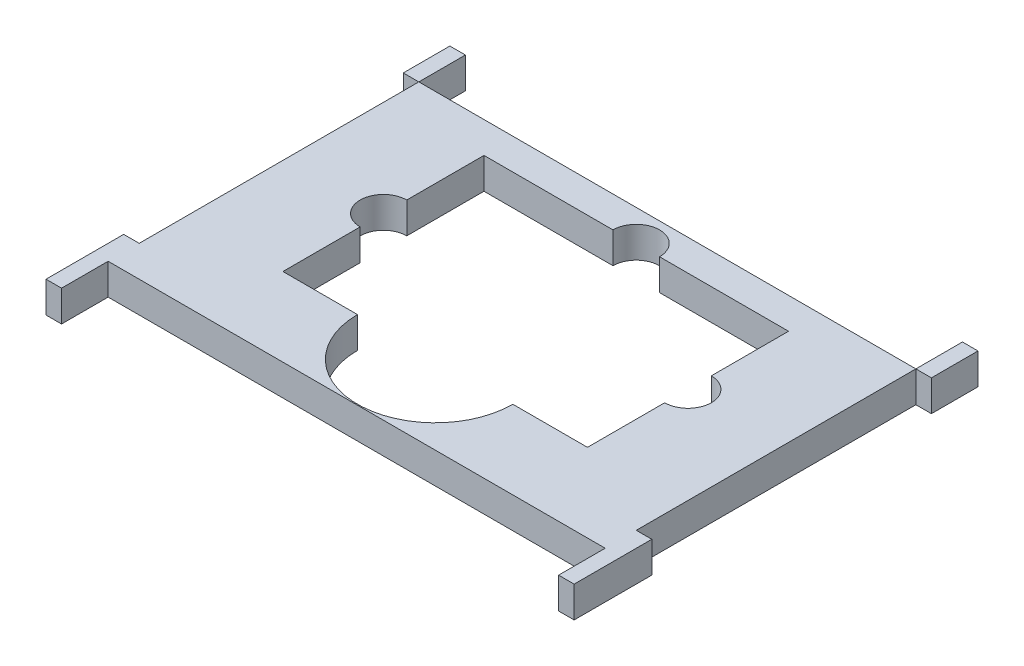
ISO-10303-21;
HEADER;
FILE_DESCRIPTION(('STEP AP214'),'2;1');
FILE_NAME('part.step','',(''),(''),'','','');
FILE_SCHEMA(('AUTOMOTIVE_DESIGN { 1 0 10303 214 1 1 1 1 }'));
ENDSEC;
DATA;
#1=APPLICATION_CONTEXT('core data for automotive mechanical design processes');
#2=APPLICATION_PROTOCOL_DEFINITION('international standard','automotive_design',2000,#1);
#3=PRODUCT_CONTEXT('',#1,'mechanical');
#4=PRODUCT('Part','Part','',(#3));
#5=PRODUCT_RELATED_PRODUCT_CATEGORY('part','',(#4));
#6=PRODUCT_DEFINITION_FORMATION('','',#4);
#7=PRODUCT_DEFINITION_CONTEXT('part definition',#1,'design');
#8=PRODUCT_DEFINITION('design','',#6,#7);
#9=PRODUCT_DEFINITION_SHAPE('','',#8);
#10=(LENGTH_UNIT() NAMED_UNIT(*) SI_UNIT(.MILLI.,.METRE.));
#11=(NAMED_UNIT(*) PLANE_ANGLE_UNIT() SI_UNIT($,.RADIAN.));
#12=(NAMED_UNIT(*) SI_UNIT($,.STERADIAN.) SOLID_ANGLE_UNIT());
#13=UNCERTAINTY_MEASURE_WITH_UNIT(LENGTH_MEASURE(1.E-05),#10,'distance_accuracy_value','');
#14=(GEOMETRIC_REPRESENTATION_CONTEXT(3) GLOBAL_UNCERTAINTY_ASSIGNED_CONTEXT((#13)) GLOBAL_UNIT_ASSIGNED_CONTEXT((#10,
#11,#12)) REPRESENTATION_CONTEXT('',''));
#15=CARTESIAN_POINT('',(0.,0.,0.));
#16=DIRECTION('',(0.,0.,1.));
#17=DIRECTION('',(1.,0.,0.));
#18=AXIS2_PLACEMENT_3D('',#15,#16,#17);
#19=CARTESIAN_POINT('',(101.6,12.7,-82.55));
#20=DIRECTION('',(1.,0.,0.));
#21=DIRECTION('',(0.,0.,-1.));
#22=AXIS2_PLACEMENT_3D('',#19,#20,#21);
#23=PLANE('',#22);
#24=DIRECTION('',(0.,0.,1.));
#25=VECTOR('',#24,1.);
#26=CARTESIAN_POINT('',(101.6,0.,-82.55));
#27=LINE('',#26,#25);
#28=CARTESIAN_POINT('',(101.6,0.,-82.55));
#29=VERTEX_POINT('',#28);
#30=CARTESIAN_POINT('',(101.6,0.,-63.4999999999999));
#31=VERTEX_POINT('',#30);
#32=EDGE_CURVE('E106',#29,#31,#27,.T.);
#33=ORIENTED_EDGE('',*,*,#32,.T.);
#34=DIRECTION('',(0.,-1.,0.));
#35=VECTOR('',#34,1.);
#36=CARTESIAN_POINT('',(101.6,12.7,-63.4999999999999));
#37=LINE('',#36,#35);
#38=CARTESIAN_POINT('',(101.6,12.7,-63.4999999999999));
#39=VERTEX_POINT('',#38);
#40=EDGE_CURVE('E12',#39,#31,#37,.T.);
#41=ORIENTED_EDGE('',*,*,#40,.F.);
#42=DIRECTION('',(0.,0.,1.));
#43=VECTOR('',#42,1.);
#44=CARTESIAN_POINT('',(101.6,12.7,-82.55));
#45=LINE('',#44,#43);
#46=CARTESIAN_POINT('',(101.6,12.7,-82.55));
#47=VERTEX_POINT('',#46);
#48=EDGE_CURVE('E94',#47,#39,#45,.T.);
#49=ORIENTED_EDGE('',*,*,#48,.F.);
#50=DIRECTION('',(0.,-1.,0.));
#51=VECTOR('',#50,1.);
#52=CARTESIAN_POINT('',(101.6,12.7,-82.55));
#53=LINE('',#52,#51);
#54=EDGE_CURVE('E102',#47,#29,#53,.T.);
#55=ORIENTED_EDGE('',*,*,#54,.T.);
#56=EDGE_LOOP('',(#33,#41,#49,#55));
#57=FACE_BOUND('',#56,.T.);
#58=ADVANCED_FACE('F43',(#57),#23,.F.);
#59=CARTESIAN_POINT('',(101.6,12.7,-63.4999999999999));
#60=DIRECTION('',(0.,0.,-1.));
#61=DIRECTION('',(-1.,0.,0.));
#62=AXIS2_PLACEMENT_3D('',#59,#60,#61);
#63=PLANE('',#62);
#64=DIRECTION('',(1.,0.,0.));
#65=VECTOR('',#64,1.);
#66=CARTESIAN_POINT('',(101.6,0.,-63.4999999999999));
#67=LINE('',#66,#65);
#68=CARTESIAN_POINT('',(107.95,0.,-63.5));
#69=VERTEX_POINT('',#68);
#70=EDGE_CURVE('E98',#31,#69,#67,.T.);
#71=ORIENTED_EDGE('',*,*,#70,.T.);
#72=DIRECTION('',(0.,-1.,0.));
#73=VECTOR('',#72,1.);
#74=CARTESIAN_POINT('',(107.95,12.7,-63.5));
#75=LINE('',#74,#73);
#76=CARTESIAN_POINT('',(107.95,12.7,-63.5));
#77=VERTEX_POINT('',#76);
#78=EDGE_CURVE('E51',#77,#69,#75,.T.);
#79=ORIENTED_EDGE('',*,*,#78,.F.);
#80=DIRECTION('',(1.,0.,0.));
#81=VECTOR('',#80,1.);
#82=CARTESIAN_POINT('',(101.6,12.7,-63.4999999999999));
#83=LINE('',#82,#81);
#84=EDGE_CURVE('E89',#39,#77,#83,.T.);
#85=ORIENTED_EDGE('',*,*,#84,.F.);
#86=ORIENTED_EDGE('',*,*,#40,.T.);
#87=EDGE_LOOP('',(#71,#79,#85,#86));
#88=FACE_BOUND('',#87,.T.);
#89=ADVANCED_FACE('F97',(#88),#63,.F.);
#90=CARTESIAN_POINT('',(107.95,12.7,-63.5));
#91=DIRECTION('',(-1.,0.,0.));
#92=DIRECTION('',(0.,0.,1.));
#93=AXIS2_PLACEMENT_3D('',#90,#91,#92);
#94=PLANE('',#93);
#95=DIRECTION('',(0.,0.,-1.));
#96=VECTOR('',#95,1.);
#97=CARTESIAN_POINT('',(107.95,0.,-63.5));
#98=LINE('',#97,#96);
#99=CARTESIAN_POINT('',(107.949999999999,0.,-82.55));
#100=VERTEX_POINT('',#99);
#101=EDGE_CURVE('E76',#69,#100,#98,.T.);
#102=ORIENTED_EDGE('',*,*,#101,.T.);
#103=DIRECTION('',(0.,-1.,0.));
#104=VECTOR('',#103,1.);
#105=CARTESIAN_POINT('',(107.949999999999,12.7,-82.55));
#106=LINE('',#105,#104);
#107=CARTESIAN_POINT('',(107.949999999999,12.7,-82.55));
#108=VERTEX_POINT('',#107);
#109=EDGE_CURVE('E99',#108,#100,#106,.T.);
#110=ORIENTED_EDGE('',*,*,#109,.F.);
#111=DIRECTION('',(0.,0.,-1.));
#112=VECTOR('',#111,1.);
#113=CARTESIAN_POINT('',(107.95,12.7,-63.5));
#114=LINE('',#113,#112);
#115=EDGE_CURVE('E92',#77,#108,#114,.T.);
#116=ORIENTED_EDGE('',*,*,#115,.F.);
#117=ORIENTED_EDGE('',*,*,#78,.T.);
#118=EDGE_LOOP('',(#102,#110,#116,#117));
#119=FACE_BOUND('',#118,.T.);
#120=ADVANCED_FACE('F100',(#119),#94,.F.);
#121=CARTESIAN_POINT('',(107.949999999999,12.7,-82.55));
#122=DIRECTION('',(0.,0.,1.));
#123=DIRECTION('',(1.,0.,0.));
#124=AXIS2_PLACEMENT_3D('',#121,#122,#123);
#125=PLANE('',#124);
#126=DIRECTION('',(-1.,0.,0.));
#127=VECTOR('',#126,1.);
#128=CARTESIAN_POINT('',(107.949999999999,0.,-82.55));
#129=LINE('',#128,#127);
#130=EDGE_CURVE('E82',#100,#29,#129,.T.);
#131=ORIENTED_EDGE('',*,*,#130,.T.);
#132=ORIENTED_EDGE('',*,*,#54,.F.);
#133=DIRECTION('',(-1.,0.,0.));
#134=VECTOR('',#133,1.);
#135=CARTESIAN_POINT('',(107.949999999999,12.7,-82.55));
#136=LINE('',#135,#134);
#137=EDGE_CURVE('E59',#108,#47,#136,.T.);
#138=ORIENTED_EDGE('',*,*,#137,.F.);
#139=ORIENTED_EDGE('',*,*,#109,.T.);
#140=EDGE_LOOP('',(#131,#132,#138,#139));
#141=FACE_BOUND('',#140,.T.);
#142=ADVANCED_FACE('F113',(#141),#125,.F.);
#143=CARTESIAN_POINT('',(0.,12.7,0.));
#144=DIRECTION('',(0.,1.,0.));
#145=DIRECTION('',(0.,0.,1.));
#146=AXIS2_PLACEMENT_3D('',#143,#144,#145);
#147=PLANE('',#146);
#148=ORIENTED_EDGE('',*,*,#48,.T.);
#149=ORIENTED_EDGE('',*,*,#84,.T.);
#150=ORIENTED_EDGE('',*,*,#115,.T.);
#151=ORIENTED_EDGE('',*,*,#137,.T.);
#152=EDGE_LOOP('',(#148,#149,#150,#151));
#153=FACE_BOUND('',#152,.T.);
#154=ADVANCED_FACE('F90',(#153),#147,.T.);
#155=CARTESIAN_POINT('',(0.,0.,0.));
#156=DIRECTION('',(0.,1.,0.));
#157=DIRECTION('',(0.,0.,1.));
#158=AXIS2_PLACEMENT_3D('',#155,#156,#157);
#159=PLANE('',#158);
#160=ORIENTED_EDGE('',*,*,#32,.F.);
#161=ORIENTED_EDGE('',*,*,#130,.F.);
#162=ORIENTED_EDGE('',*,*,#101,.F.);
#163=ORIENTED_EDGE('',*,*,#70,.F.);
#164=EDGE_LOOP('',(#160,#161,#162,#163));
#165=FACE_BOUND('',#164,.T.);
#166=ADVANCED_FACE('F116',(#165),#159,.F.);
#167=CLOSED_SHELL('',(#58,#89,#120,#142,#154,#166));
#168=MANIFOLD_SOLID_BREP('B2',#167);
#169=CARTESIAN_POINT('',(-101.6,12.7,-63.4999999999999));
#170=DIRECTION('',(0.,0.,-1.));
#171=DIRECTION('',(-1.,0.,0.));
#172=AXIS2_PLACEMENT_3D('',#169,#170,#171);
#173=PLANE('',#172);
#174=DIRECTION('',(1.,0.,0.));
#175=VECTOR('',#174,1.);
#176=CARTESIAN_POINT('',(-101.6,0.,-63.4999999999999));
#177=LINE('',#176,#175);
#178=CARTESIAN_POINT('',(-107.95,0.,-63.5));
#179=VERTEX_POINT('',#178);
#180=CARTESIAN_POINT('',(-101.6,0.,-63.4999999999999));
#181=VERTEX_POINT('',#180);
#182=EDGE_CURVE('E238',#179,#181,#177,.T.);
#183=ORIENTED_EDGE('',*,*,#182,.T.);
#184=DIRECTION('',(0.,-1.,0.));
#185=VECTOR('',#184,1.);
#186=CARTESIAN_POINT('',(-101.6,12.7,-63.4999999999999));
#187=LINE('',#186,#185);
#188=CARTESIAN_POINT('',(-101.6,12.7,-63.4999999999999));
#189=VERTEX_POINT('',#188);
#190=EDGE_CURVE('E41',#189,#181,#187,.T.);
#191=ORIENTED_EDGE('',*,*,#190,.F.);
#192=DIRECTION('',(1.,0.,0.));
#193=VECTOR('',#192,1.);
#194=CARTESIAN_POINT('',(-101.6,12.7,-63.4999999999999));
#195=LINE('',#194,#193);
#196=CARTESIAN_POINT('',(-107.95,12.7,-63.5));
#197=VERTEX_POINT('',#196);
#198=EDGE_CURVE('E226',#197,#189,#195,.T.);
#199=ORIENTED_EDGE('',*,*,#198,.F.);
#200=DIRECTION('',(0.,-1.,0.));
#201=VECTOR('',#200,1.);
#202=CARTESIAN_POINT('',(-107.95,12.7,-63.5));
#203=LINE('',#202,#201);
#204=EDGE_CURVE('E234',#197,#179,#203,.T.);
#205=ORIENTED_EDGE('',*,*,#204,.T.);
#206=EDGE_LOOP('',(#183,#191,#199,#205));
#207=FACE_BOUND('',#206,.T.);
#208=ADVANCED_FACE('F175',(#207),#173,.F.);
#209=CARTESIAN_POINT('',(-101.6,12.7,-82.55));
#210=DIRECTION('',(-1.,0.,0.));
#211=DIRECTION('',(0.,0.,1.));
#212=AXIS2_PLACEMENT_3D('',#209,#210,#211);
#213=PLANE('',#212);
#214=DIRECTION('',(0.,0.,-1.));
#215=VECTOR('',#214,1.);
#216=CARTESIAN_POINT('',(-101.6,0.,-82.55));
#217=LINE('',#216,#215);
#218=CARTESIAN_POINT('',(-101.6,0.,-82.55));
#219=VERTEX_POINT('',#218);
#220=EDGE_CURVE('E230',#181,#219,#217,.T.);
#221=ORIENTED_EDGE('',*,*,#220,.T.);
#222=DIRECTION('',(0.,-1.,0.));
#223=VECTOR('',#222,1.);
#224=CARTESIAN_POINT('',(-101.6,12.7,-82.55));
#225=LINE('',#224,#223);
#226=CARTESIAN_POINT('',(-101.6,12.7,-82.55));
#227=VERTEX_POINT('',#226);
#228=EDGE_CURVE('E183',#227,#219,#225,.T.);
#229=ORIENTED_EDGE('',*,*,#228,.F.);
#230=DIRECTION('',(0.,0.,-1.));
#231=VECTOR('',#230,1.);
#232=CARTESIAN_POINT('',(-101.6,12.7,-82.55));
#233=LINE('',#232,#231);
#234=EDGE_CURVE('E221',#189,#227,#233,.T.);
#235=ORIENTED_EDGE('',*,*,#234,.F.);
#236=ORIENTED_EDGE('',*,*,#190,.T.);
#237=EDGE_LOOP('',(#221,#229,#235,#236));
#238=FACE_BOUND('',#237,.T.);
#239=ADVANCED_FACE('F229',(#238),#213,.F.);
#240=CARTESIAN_POINT('',(-107.949999999999,12.7,-82.55));
#241=DIRECTION('',(0.,0.,1.));
#242=DIRECTION('',(1.,0.,0.));
#243=AXIS2_PLACEMENT_3D('',#240,#241,#242);
#244=PLANE('',#243);
#245=DIRECTION('',(-1.,0.,0.));
#246=VECTOR('',#245,1.);
#247=CARTESIAN_POINT('',(-107.949999999999,0.,-82.55));
#248=LINE('',#247,#246);
#249=CARTESIAN_POINT('',(-107.949999999999,0.,-82.55));
#250=VERTEX_POINT('',#249);
#251=EDGE_CURVE('E208',#219,#250,#248,.T.);
#252=ORIENTED_EDGE('',*,*,#251,.T.);
#253=DIRECTION('',(0.,-1.,0.));
#254=VECTOR('',#253,1.);
#255=CARTESIAN_POINT('',(-107.949999999999,12.7,-82.55));
#256=LINE('',#255,#254);
#257=CARTESIAN_POINT('',(-107.949999999999,12.7,-82.55));
#258=VERTEX_POINT('',#257);
#259=EDGE_CURVE('E231',#258,#250,#256,.T.);
#260=ORIENTED_EDGE('',*,*,#259,.F.);
#261=DIRECTION('',(-1.,0.,0.));
#262=VECTOR('',#261,1.);
#263=CARTESIAN_POINT('',(-107.949999999999,12.7,-82.55));
#264=LINE('',#263,#262);
#265=EDGE_CURVE('E224',#227,#258,#264,.T.);
#266=ORIENTED_EDGE('',*,*,#265,.F.);
#267=ORIENTED_EDGE('',*,*,#228,.T.);
#268=EDGE_LOOP('',(#252,#260,#266,#267));
#269=FACE_BOUND('',#268,.T.);
#270=ADVANCED_FACE('F232',(#269),#244,.F.);
#271=CARTESIAN_POINT('',(-107.95,12.7,-63.5));
#272=DIRECTION('',(1.,0.,0.));
#273=DIRECTION('',(0.,0.,-1.));
#274=AXIS2_PLACEMENT_3D('',#271,#272,#273);
#275=PLANE('',#274);
#276=DIRECTION('',(0.,0.,1.));
#277=VECTOR('',#276,1.);
#278=CARTESIAN_POINT('',(-107.95,0.,-63.5));
#279=LINE('',#278,#277);
#280=EDGE_CURVE('E214',#250,#179,#279,.T.);
#281=ORIENTED_EDGE('',*,*,#280,.T.);
#282=ORIENTED_EDGE('',*,*,#204,.F.);
#283=DIRECTION('',(0.,0.,1.));
#284=VECTOR('',#283,1.);
#285=CARTESIAN_POINT('',(-107.95,12.7,-63.5));
#286=LINE('',#285,#284);
#287=EDGE_CURVE('E191',#258,#197,#286,.T.);
#288=ORIENTED_EDGE('',*,*,#287,.F.);
#289=ORIENTED_EDGE('',*,*,#259,.T.);
#290=EDGE_LOOP('',(#281,#282,#288,#289));
#291=FACE_BOUND('',#290,.T.);
#292=ADVANCED_FACE('F245',(#291),#275,.F.);
#293=CARTESIAN_POINT('',(0.,12.7,0.));
#294=DIRECTION('',(0.,-1.,0.));
#295=DIRECTION('',(0.,0.,-1.));
#296=AXIS2_PLACEMENT_3D('',#293,#294,#295);
#297=PLANE('',#296);
#298=ORIENTED_EDGE('',*,*,#198,.T.);
#299=ORIENTED_EDGE('',*,*,#234,.T.);
#300=ORIENTED_EDGE('',*,*,#265,.T.);
#301=ORIENTED_EDGE('',*,*,#287,.T.);
#302=EDGE_LOOP('',(#298,#299,#300,#301));
#303=FACE_BOUND('',#302,.T.);
#304=ADVANCED_FACE('F222',(#303),#297,.F.);
#305=CARTESIAN_POINT('',(0.,0.,0.));
#306=DIRECTION('',(0.,-1.,0.));
#307=DIRECTION('',(0.,0.,-1.));
#308=AXIS2_PLACEMENT_3D('',#305,#306,#307);
#309=PLANE('',#308);
#310=ORIENTED_EDGE('',*,*,#182,.F.);
#311=ORIENTED_EDGE('',*,*,#280,.F.);
#312=ORIENTED_EDGE('',*,*,#251,.F.);
#313=ORIENTED_EDGE('',*,*,#220,.F.);
#314=EDGE_LOOP('',(#310,#311,#312,#313));
#315=FACE_BOUND('',#314,.T.);
#316=ADVANCED_FACE('F248',(#315),#309,.T.);
#317=CLOSED_SHELL('',(#208,#239,#270,#292,#304,#316));
#318=MANIFOLD_SOLID_BREP('B6',#317);
#319=CARTESIAN_POINT('',(-62.25,12.7,-50.8));
#320=DIRECTION('',(1.,0.,0.));
#321=DIRECTION('',(0.,0.,-1.));
#322=AXIS2_PLACEMENT_3D('',#319,#320,#321);
#323=PLANE('',#322);
#324=DIRECTION('',(0.,1.,0.));
#325=VECTOR('',#324,1.);
#326=CARTESIAN_POINT('',(-62.25,0.,-19.225000031));
#327=LINE('',#326,#325);
#328=CARTESIAN_POINT('',(-62.25,0.,-19.225000031));
#329=VERTEX_POINT('',#328);
#330=CARTESIAN_POINT('',(-62.25,12.7,-19.225000031));
#331=VERTEX_POINT('',#330);
#332=EDGE_CURVE('E173',#329,#331,#327,.T.);
#333=ORIENTED_EDGE('',*,*,#332,.F.);
#334=DIRECTION('',(0.,0.,1.));
#335=VECTOR('',#334,1.);
#336=CARTESIAN_POINT('',(-62.25,0.,-50.8));
#337=LINE('',#336,#335);
#338=CARTESIAN_POINT('',(-62.25,0.,-50.8));
#339=VERTEX_POINT('',#338);
#340=EDGE_CURVE('E493',#339,#329,#337,.T.);
#341=ORIENTED_EDGE('',*,*,#340,.F.);
#342=DIRECTION('',(0.,-1.,0.));
#343=VECTOR('',#342,1.);
#344=CARTESIAN_POINT('',(-62.25,12.7,-50.8));
#345=LINE('',#344,#343);
#346=CARTESIAN_POINT('',(-62.25,12.7,-50.8));
#347=VERTEX_POINT('',#346);
#348=EDGE_CURVE('E485',#347,#339,#345,.T.);
#349=ORIENTED_EDGE('',*,*,#348,.F.);
#350=DIRECTION('',(0.,0.,1.));
#351=VECTOR('',#350,1.);
#352=CARTESIAN_POINT('',(-62.25,12.7,-50.8));
#353=LINE('',#352,#351);
#354=EDGE_CURVE('E579',#347,#331,#353,.T.);
#355=ORIENTED_EDGE('',*,*,#354,.T.);
#356=EDGE_LOOP('',(#333,#341,#349,#355));
#357=FACE_BOUND('',#356,.T.);
#358=ADVANCED_FACE('F298',(#357),#323,.T.);
#359=CARTESIAN_POINT('',(-62.25,12.7,31.3999999380001));
#360=DIRECTION('',(0.,0.,-1.));
#361=DIRECTION('',(-1.,0.,0.));
#362=AXIS2_PLACEMENT_3D('',#359,#360,#361);
#363=PLANE('',#362);
#364=DIRECTION('',(0.,1.,0.));
#365=VECTOR('',#364,1.);
#366=CARTESIAN_POINT('',(-31.75,0.,31.3999999380001));
#367=LINE('',#366,#365);
#368=CARTESIAN_POINT('',(-31.75,0.,31.3999999380001));
#369=VERTEX_POINT('',#368);
#370=CARTESIAN_POINT('',(-31.75,12.7,31.3999999380001));
#371=VERTEX_POINT('',#370);
#372=EDGE_CURVE('E552',#369,#371,#367,.T.);
#373=ORIENTED_EDGE('',*,*,#372,.F.);
#374=DIRECTION('',(1.,0.,0.));
#375=VECTOR('',#374,1.);
#376=CARTESIAN_POINT('',(-62.25,0.,31.3999999380001));
#377=LINE('',#376,#375);
#378=CARTESIAN_POINT('',(-62.25,0.,31.3999999380001));
#379=VERTEX_POINT('',#378);
#380=EDGE_CURVE('E498',#379,#369,#377,.T.);
#381=ORIENTED_EDGE('',*,*,#380,.F.);
#382=DIRECTION('',(0.,-1.,0.));
#383=VECTOR('',#382,1.);
#384=CARTESIAN_POINT('',(-62.25,12.7,31.3999999380001));
#385=LINE('',#384,#383);
#386=CARTESIAN_POINT('',(-62.25,12.7,31.3999999380001));
#387=VERTEX_POINT('',#386);
#388=EDGE_CURVE('E513',#387,#379,#385,.T.);
#389=ORIENTED_EDGE('',*,*,#388,.F.);
#390=DIRECTION('',(1.,0.,0.));
#391=VECTOR('',#390,1.);
#392=CARTESIAN_POINT('',(-62.25,12.7,31.3999999380001));
#393=LINE('',#392,#391);
#394=EDGE_CURVE('E582',#387,#371,#393,.T.);
#395=ORIENTED_EDGE('',*,*,#394,.T.);
#396=EDGE_LOOP('',(#373,#381,#389,#395));
#397=FACE_BOUND('',#396,.T.);
#398=ADVANCED_FACE('F719',(#397),#363,.T.);
#399=CARTESIAN_POINT('',(62.25,12.7,-50.8));
#400=DIRECTION('',(-1.,0.,0.));
#401=DIRECTION('',(0.,0.,1.));
#402=AXIS2_PLACEMENT_3D('',#399,#400,#401);
#403=PLANE('',#402);
#404=DIRECTION('',(0.,1.,0.));
#405=VECTOR('',#404,1.);
#406=CARTESIAN_POINT('',(62.25,0.,-0.175000030999945));
#407=LINE('',#406,#405);
#408=CARTESIAN_POINT('',(62.25,0.,-0.175000030999945));
#409=VERTEX_POINT('',#408);
#410=CARTESIAN_POINT('',(62.25,12.7,-0.175000030999945));
#411=VERTEX_POINT('',#410);
#412=EDGE_CURVE('E548',#409,#411,#407,.T.);
#413=ORIENTED_EDGE('',*,*,#412,.F.);
#414=DIRECTION('',(0.,0.,-1.));
#415=VECTOR('',#414,1.);
#416=CARTESIAN_POINT('',(62.25,0.,-50.8));
#417=LINE('',#416,#415);
#418=CARTESIAN_POINT('',(62.25,0.,31.3999999380001));
#419=VERTEX_POINT('',#418);
#420=EDGE_CURVE('E502',#419,#409,#417,.T.);
#421=ORIENTED_EDGE('',*,*,#420,.F.);
#422=DIRECTION('',(0.,-1.,0.));
#423=VECTOR('',#422,1.);
#424=CARTESIAN_POINT('',(62.25,12.7,31.3999999380001));
#425=LINE('',#424,#423);
#426=CARTESIAN_POINT('',(62.25,12.7,31.3999999380001));
#427=VERTEX_POINT('',#426);
#428=EDGE_CURVE('E510',#427,#419,#425,.T.);
#429=ORIENTED_EDGE('',*,*,#428,.F.);
#430=DIRECTION('',(0.,0.,-1.));
#431=VECTOR('',#430,1.);
#432=CARTESIAN_POINT('',(62.25,12.7,-50.8));
#433=LINE('',#432,#431);
#434=EDGE_CURVE('E489',#427,#411,#433,.T.);
#435=ORIENTED_EDGE('',*,*,#434,.T.);
#436=EDGE_LOOP('',(#413,#421,#429,#435));
#437=FACE_BOUND('',#436,.T.);
#438=ADVANCED_FACE('F598',(#437),#403,.T.);
#439=CARTESIAN_POINT('',(-62.25,12.7,-50.8));
#440=DIRECTION('',(0.,0.,1.));
#441=DIRECTION('',(1.,0.,0.));
#442=AXIS2_PLACEMENT_3D('',#439,#440,#441);
#443=PLANE('',#442);
#444=DIRECTION('',(0.,1.,0.));
#445=VECTOR('',#444,1.);
#446=CARTESIAN_POINT('',(9.525,0.,-50.8));
#447=LINE('',#446,#445);
#448=CARTESIAN_POINT('',(9.525,0.,-50.8));
#449=VERTEX_POINT('',#448);
#450=CARTESIAN_POINT('',(9.525,12.7,-50.8));
#451=VERTEX_POINT('',#450);
#452=EDGE_CURVE('E457',#449,#451,#447,.T.);
#453=ORIENTED_EDGE('',*,*,#452,.F.);
#454=DIRECTION('',(-1.,0.,0.));
#455=VECTOR('',#454,1.);
#456=CARTESIAN_POINT('',(-62.25,0.,-50.8));
#457=LINE('',#456,#455);
#458=CARTESIAN_POINT('',(62.25,0.,-50.8));
#459=VERTEX_POINT('',#458);
#460=EDGE_CURVE('E506',#459,#449,#457,.T.);
#461=ORIENTED_EDGE('',*,*,#460,.F.);
#462=DIRECTION('',(0.,-1.,0.));
#463=VECTOR('',#462,1.);
#464=CARTESIAN_POINT('',(62.25,12.7,-50.8));
#465=LINE('',#464,#463);
#466=CARTESIAN_POINT('',(62.25,12.7,-50.8));
#467=VERTEX_POINT('',#466);
#468=EDGE_CURVE('E484',#467,#459,#465,.T.);
#469=ORIENTED_EDGE('',*,*,#468,.F.);
#470=DIRECTION('',(-1.,0.,0.));
#471=VECTOR('',#470,1.);
#472=CARTESIAN_POINT('',(-62.25,12.7,-50.8));
#473=LINE('',#472,#471);
#474=EDGE_CURVE('E476',#467,#451,#473,.T.);
#475=ORIENTED_EDGE('',*,*,#474,.T.);
#476=EDGE_LOOP('',(#453,#461,#469,#475));
#477=FACE_BOUND('',#476,.T.);
#478=ADVANCED_FACE('F482',(#477),#443,.T.);
#479=CARTESIAN_POINT('',(-101.6,12.7,-63.5));
#480=DIRECTION('',(1.,0.,0.));
#481=DIRECTION('',(0.,0.,-1.));
#482=AXIS2_PLACEMENT_3D('',#479,#480,#481);
#483=PLANE('',#482);
#484=DIRECTION('',(0.,-1.,0.));
#485=VECTOR('',#484,1.);
#486=CARTESIAN_POINT('',(-101.6,12.7,50.8));
#487=LINE('',#486,#485);
#488=CARTESIAN_POINT('',(-101.6,12.7,50.8));
#489=VERTEX_POINT('',#488);
#490=CARTESIAN_POINT('',(-101.6,0.,50.8));
#491=VERTEX_POINT('',#490);
#492=EDGE_CURVE('E620',#489,#491,#487,.T.);
#493=ORIENTED_EDGE('',*,*,#492,.F.);
#494=DIRECTION('',(0.,0.,1.));
#495=VECTOR('',#494,1.);
#496=CARTESIAN_POINT('',(-101.6,12.7,-63.5));
#497=LINE('',#496,#495);
#498=CARTESIAN_POINT('',(-101.6,12.7,-63.5));
#499=VERTEX_POINT('',#498);
#500=EDGE_CURVE('E517',#499,#489,#497,.T.);
#501=ORIENTED_EDGE('',*,*,#500,.F.);
#502=DIRECTION('',(0.,-1.,0.));
#503=VECTOR('',#502,1.);
#504=CARTESIAN_POINT('',(-101.6,12.7,-63.5));
#505=LINE('',#504,#503);
#506=CARTESIAN_POINT('',(-101.6,0.,-63.5));
#507=VERTEX_POINT('',#506);
#508=EDGE_CURVE('E528',#499,#507,#505,.T.);
#509=ORIENTED_EDGE('',*,*,#508,.T.);
#510=DIRECTION('',(0.,0.,1.));
#511=VECTOR('',#510,1.);
#512=CARTESIAN_POINT('',(-101.6,0.,-63.5));
#513=LINE('',#512,#511);
#514=EDGE_CURVE('E516',#507,#491,#513,.T.);
#515=ORIENTED_EDGE('',*,*,#514,.T.);
#516=EDGE_LOOP('',(#493,#501,#509,#515));
#517=FACE_BOUND('',#516,.T.);
#518=ADVANCED_FACE('F300',(#517),#483,.F.);
#519=CARTESIAN_POINT('',(0.,12.7,0.));
#520=DIRECTION('',(0.,-1.,0.));
#521=DIRECTION('',(0.,0.,-1.));
#522=AXIS2_PLACEMENT_3D('',#519,#520,#521);
#523=PLANE('',#522);
#524=ORIENTED_EDGE('',*,*,#500,.T.);
#525=DIRECTION('',(-1.,0.,0.));
#526=VECTOR('',#525,1.);
#527=CARTESIAN_POINT('',(-101.6,12.7,50.8));
#528=LINE('',#527,#526);
#529=CARTESIAN_POINT('',(-107.949999999999,12.7,50.8));
#530=VERTEX_POINT('',#529);
#531=EDGE_CURVE('E609',#489,#530,#528,.T.);
#532=ORIENTED_EDGE('',*,*,#531,.T.);
#533=DIRECTION('',(0.,0.,1.));
#534=VECTOR('',#533,1.);
#535=CARTESIAN_POINT('',(-107.949999999999,12.7,50.8));
#536=LINE('',#535,#534);
#537=CARTESIAN_POINT('',(-107.949999999999,12.7,82.55));
#538=VERTEX_POINT('',#537);
#539=EDGE_CURVE('E612',#530,#538,#536,.T.);
#540=ORIENTED_EDGE('',*,*,#539,.T.);
#541=DIRECTION('',(1.,0.,0.));
#542=VECTOR('',#541,1.);
#543=CARTESIAN_POINT('',(-107.949999999999,12.7,82.55));
#544=LINE('',#543,#542);
#545=CARTESIAN_POINT('',(-101.6,12.7,82.55));
#546=VERTEX_POINT('',#545);
#547=EDGE_CURVE('E615',#538,#546,#544,.T.);
#548=ORIENTED_EDGE('',*,*,#547,.T.);
#549=DIRECTION('',(0.,0.,-1.));
#550=VECTOR('',#549,1.);
#551=CARTESIAN_POINT('',(-101.6,12.7,82.55));
#552=LINE('',#551,#550);
#553=CARTESIAN_POINT('',(-101.6,12.7,63.5));
#554=VERTEX_POINT('',#553);
#555=EDGE_CURVE('E617',#546,#554,#552,.T.);
#556=ORIENTED_EDGE('',*,*,#555,.T.);
#557=DIRECTION('',(1.,0.,0.));
#558=VECTOR('',#557,1.);
#559=CARTESIAN_POINT('',(101.6,12.7,63.5));
#560=LINE('',#559,#558);
#561=CARTESIAN_POINT('',(101.6,12.7,63.5));
#562=VERTEX_POINT('',#561);
#563=EDGE_CURVE('E520',#554,#562,#560,.T.);
#564=ORIENTED_EDGE('',*,*,#563,.T.);
#565=DIRECTION('',(0.,0.,1.));
#566=VECTOR('',#565,1.);
#567=CARTESIAN_POINT('',(101.6,12.7,82.55));
#568=LINE('',#567,#566);
#569=CARTESIAN_POINT('',(101.6,12.7,82.55));
#570=VERTEX_POINT('',#569);
#571=EDGE_CURVE('E642',#562,#570,#568,.T.);
#572=ORIENTED_EDGE('',*,*,#571,.T.);
#573=DIRECTION('',(1.,0.,0.));
#574=VECTOR('',#573,1.);
#575=CARTESIAN_POINT('',(107.949999999999,12.7,82.55));
#576=LINE('',#575,#574);
#577=CARTESIAN_POINT('',(107.949999999999,12.7,82.55));
#578=VERTEX_POINT('',#577);
#579=EDGE_CURVE('E644',#570,#578,#576,.T.);
#580=ORIENTED_EDGE('',*,*,#579,.T.);
#581=DIRECTION('',(0.,0.,-1.));
#582=VECTOR('',#581,1.);
#583=CARTESIAN_POINT('',(107.949999999999,12.7,50.8));
#584=LINE('',#583,#582);
#585=CARTESIAN_POINT('',(107.949999999999,12.7,50.8));
#586=VERTEX_POINT('',#585);
#587=EDGE_CURVE('E647',#578,#586,#584,.T.);
#588=ORIENTED_EDGE('',*,*,#587,.T.);
#589=DIRECTION('',(-1.,0.,0.));
#590=VECTOR('',#589,1.);
#591=CARTESIAN_POINT('',(101.6,12.7,50.8));
#592=LINE('',#591,#590);
#593=CARTESIAN_POINT('',(101.6,12.7,50.8));
#594=VERTEX_POINT('',#593);
#595=EDGE_CURVE('E649',#586,#594,#592,.T.);
#596=ORIENTED_EDGE('',*,*,#595,.T.);
#597=DIRECTION('',(0.,0.,-1.));
#598=VECTOR('',#597,1.);
#599=CARTESIAN_POINT('',(101.6,12.7,-63.5));
#600=LINE('',#599,#598);
#601=CARTESIAN_POINT('',(101.6,12.7,-63.5));
#602=VERTEX_POINT('',#601);
#603=EDGE_CURVE('E524',#594,#602,#600,.T.);
#604=ORIENTED_EDGE('',*,*,#603,.T.);
#605=DIRECTION('',(-1.,0.,0.));
#606=VECTOR('',#605,1.);
#607=CARTESIAN_POINT('',(101.6,12.7,-63.5));
#608=LINE('',#607,#606);
#609=EDGE_CURVE('E526',#602,#499,#608,.T.);
#610=ORIENTED_EDGE('',*,*,#609,.T.);
#611=EDGE_LOOP('',(#524,#532,#540,#548,#556,#564,#572,#580,#588,#596,#604,#610));
#612=FACE_BOUND('',#611,.T.);
#613=CARTESIAN_POINT('',(-9.525,12.7,-50.8));
#614=VERTEX_POINT('',#613);
#615=EDGE_CURVE('E478',#614,#347,#473,.T.);
#616=ORIENTED_EDGE('',*,*,#615,.F.);
#617=CARTESIAN_POINT('',(0.,12.7,-50.8));
#618=DIRECTION('',(0.,1.,0.));
#619=DIRECTION('',(0.,0.,1.));
#620=AXIS2_PLACEMENT_3D('',#617,#618,#619);
#621=CIRCLE('',#620,9.525);
#622=EDGE_CURVE('E460',#451,#614,#621,.T.);
#623=ORIENTED_EDGE('',*,*,#622,.F.);
#624=ORIENTED_EDGE('',*,*,#474,.F.);
#625=CARTESIAN_POINT('',(62.25,12.7,-19.225000031));
#626=VERTEX_POINT('',#625);
#627=EDGE_CURVE('E584',#626,#467,#433,.T.);
#628=ORIENTED_EDGE('',*,*,#627,.F.);
#629=CARTESIAN_POINT('',(62.25,12.7,-9.70000003099995));
#630=DIRECTION('',(0.,1.,0.));
#631=DIRECTION('',(0.,0.,1.));
#632=AXIS2_PLACEMENT_3D('',#629,#630,#631);
#633=CIRCLE('',#632,9.52500000000001);
#634=EDGE_CURVE('E600',#411,#626,#633,.T.);
#635=ORIENTED_EDGE('',*,*,#634,.F.);
#636=ORIENTED_EDGE('',*,*,#434,.F.);
#637=CARTESIAN_POINT('',(31.75,12.7,31.3999999380001));
#638=VERTEX_POINT('',#637);
#639=EDGE_CURVE('E581',#638,#427,#393,.T.);
#640=ORIENTED_EDGE('',*,*,#639,.F.);
#641=CARTESIAN_POINT('',(0.,12.7,31.399999938));
#642=DIRECTION('',(0.,1.,0.));
#643=DIRECTION('',(0.,0.,1.));
#644=AXIS2_PLACEMENT_3D('',#641,#642,#643);
#645=CIRCLE('',#644,31.75);
#646=EDGE_CURVE('E320',#371,#638,#645,.T.);
#647=ORIENTED_EDGE('',*,*,#646,.F.);
#648=ORIENTED_EDGE('',*,*,#394,.F.);
#649=CARTESIAN_POINT('',(-62.25,12.7,-0.175000030999968));
#650=VERTEX_POINT('',#649);
#651=EDGE_CURVE('E507',#650,#387,#353,.T.);
#652=ORIENTED_EDGE('',*,*,#651,.F.);
#653=CARTESIAN_POINT('',(-62.25,12.7,-9.70000003099995));
#654=DIRECTION('',(0.,1.,0.));
#655=DIRECTION('',(0.,0.,1.));
#656=AXIS2_PLACEMENT_3D('',#653,#654,#655);
#657=CIRCLE('',#656,9.525);
#658=EDGE_CURVE('E312',#331,#650,#657,.T.);
#659=ORIENTED_EDGE('',*,*,#658,.F.);
#660=ORIENTED_EDGE('',*,*,#354,.F.);
#661=EDGE_LOOP('',(#616,#623,#624,#628,#635,#636,#640,#647,#648,#652,#659,#660));
#662=FACE_BOUND('',#661,.T.);
#663=ADVANCED_FACE('F474',(#612,#662),#523,.F.);
#664=CARTESIAN_POINT('',(0.,0.,0.));
#665=DIRECTION('',(0.,-1.,0.));
#666=DIRECTION('',(0.,0.,-1.));
#667=AXIS2_PLACEMENT_3D('',#664,#665,#666);
#668=PLANE('',#667);
#669=CARTESIAN_POINT('',(0.,0.,-50.8));
#670=DIRECTION('',(0.,1.,0.));
#671=DIRECTION('',(0.,0.,1.));
#672=AXIS2_PLACEMENT_3D('',#669,#670,#671);
#673=CIRCLE('',#672,9.525);
#674=CARTESIAN_POINT('',(-9.525,0.,-50.8));
#675=VERTEX_POINT('',#674);
#676=EDGE_CURVE('E463',#449,#675,#673,.T.);
#677=ORIENTED_EDGE('',*,*,#676,.T.);
#678=EDGE_CURVE('E505',#675,#339,#457,.T.);
#679=ORIENTED_EDGE('',*,*,#678,.T.);
#680=ORIENTED_EDGE('',*,*,#340,.T.);
#681=CARTESIAN_POINT('',(-62.25,0.,-9.70000003099995));
#682=DIRECTION('',(0.,1.,0.));
#683=DIRECTION('',(0.,0.,1.));
#684=AXIS2_PLACEMENT_3D('',#681,#682,#683);
#685=CIRCLE('',#684,9.525);
#686=CARTESIAN_POINT('',(-62.25,0.,-0.175000030999952));
#687=VERTEX_POINT('',#686);
#688=EDGE_CURVE('E479',#329,#687,#685,.T.);
#689=ORIENTED_EDGE('',*,*,#688,.T.);
#690=EDGE_CURVE('E497',#687,#379,#337,.T.);
#691=ORIENTED_EDGE('',*,*,#690,.T.);
#692=ORIENTED_EDGE('',*,*,#380,.T.);
#693=CARTESIAN_POINT('',(0.,0.,31.399999938));
#694=DIRECTION('',(0.,1.,0.));
#695=DIRECTION('',(0.,0.,1.));
#696=AXIS2_PLACEMENT_3D('',#693,#694,#695);
#697=CIRCLE('',#696,31.75);
#698=CARTESIAN_POINT('',(31.75,0.,31.3999999380001));
#699=VERTEX_POINT('',#698);
#700=EDGE_CURVE('E921',#369,#699,#697,.T.);
#701=ORIENTED_EDGE('',*,*,#700,.T.);
#702=EDGE_CURVE('E496',#699,#419,#377,.T.);
#703=ORIENTED_EDGE('',*,*,#702,.T.);
#704=ORIENTED_EDGE('',*,*,#420,.T.);
#705=CARTESIAN_POINT('',(62.25,0.,-9.70000003099995));
#706=DIRECTION('',(0.,1.,0.));
#707=DIRECTION('',(0.,0.,1.));
#708=AXIS2_PLACEMENT_3D('',#705,#706,#707);
#709=CIRCLE('',#708,9.52500000000001);
#710=CARTESIAN_POINT('',(62.25,0.,-19.225000031));
#711=VERTEX_POINT('',#710);
#712=EDGE_CURVE('E603',#409,#711,#709,.T.);
#713=ORIENTED_EDGE('',*,*,#712,.T.);
#714=EDGE_CURVE('E501',#711,#459,#417,.T.);
#715=ORIENTED_EDGE('',*,*,#714,.T.);
#716=ORIENTED_EDGE('',*,*,#460,.T.);
#717=EDGE_LOOP('',(#677,#679,#680,#689,#691,#692,#701,#703,#704,#713,#715,#716));
#718=FACE_BOUND('',#717,.T.);
#719=ORIENTED_EDGE('',*,*,#514,.F.);
#720=DIRECTION('',(-1.,0.,0.));
#721=VECTOR('',#720,1.);
#722=CARTESIAN_POINT('',(101.6,0.,-63.5));
#723=LINE('',#722,#721);
#724=CARTESIAN_POINT('',(101.6,0.,-63.5));
#725=VERTEX_POINT('',#724);
#726=EDGE_CURVE('E521',#725,#507,#723,.T.);
#727=ORIENTED_EDGE('',*,*,#726,.F.);
#728=DIRECTION('',(0.,0.,-1.));
#729=VECTOR('',#728,1.);
#730=CARTESIAN_POINT('',(101.6,0.,-63.5));
#731=LINE('',#730,#729);
#732=CARTESIAN_POINT('',(101.6,0.,50.8));
#733=VERTEX_POINT('',#732);
#734=EDGE_CURVE('E533',#733,#725,#731,.T.);
#735=ORIENTED_EDGE('',*,*,#734,.F.);
#736=DIRECTION('',(-1.,0.,0.));
#737=VECTOR('',#736,1.);
#738=CARTESIAN_POINT('',(101.6,0.,50.8));
#739=LINE('',#738,#737);
#740=CARTESIAN_POINT('',(107.949999999999,0.,50.8));
#741=VERTEX_POINT('',#740);
#742=EDGE_CURVE('E645',#741,#733,#739,.T.);
#743=ORIENTED_EDGE('',*,*,#742,.F.);
#744=DIRECTION('',(0.,0.,-1.));
#745=VECTOR('',#744,1.);
#746=CARTESIAN_POINT('',(107.949999999999,0.,50.8));
#747=LINE('',#746,#745);
#748=CARTESIAN_POINT('',(107.949999999999,0.,82.55));
#749=VERTEX_POINT('',#748);
#750=EDGE_CURVE('E655',#749,#741,#747,.T.);
#751=ORIENTED_EDGE('',*,*,#750,.F.);
#752=DIRECTION('',(1.,0.,0.));
#753=VECTOR('',#752,1.);
#754=CARTESIAN_POINT('',(107.949999999999,0.,82.55));
#755=LINE('',#754,#753);
#756=CARTESIAN_POINT('',(101.6,0.,82.55));
#757=VERTEX_POINT('',#756);
#758=EDGE_CURVE('E653',#757,#749,#755,.T.);
#759=ORIENTED_EDGE('',*,*,#758,.F.);
#760=DIRECTION('',(0.,0.,1.));
#761=VECTOR('',#760,1.);
#762=CARTESIAN_POINT('',(101.6,0.,82.55));
#763=LINE('',#762,#761);
#764=CARTESIAN_POINT('',(101.6,0.,63.5));
#765=VERTEX_POINT('',#764);
#766=EDGE_CURVE('E641',#765,#757,#763,.T.);
#767=ORIENTED_EDGE('',*,*,#766,.F.);
#768=DIRECTION('',(1.,0.,0.));
#769=VECTOR('',#768,1.);
#770=CARTESIAN_POINT('',(101.6,0.,63.5));
#771=LINE('',#770,#769);
#772=CARTESIAN_POINT('',(-101.6,0.,63.5));
#773=VERTEX_POINT('',#772);
#774=EDGE_CURVE('E530',#773,#765,#771,.T.);
#775=ORIENTED_EDGE('',*,*,#774,.F.);
#776=DIRECTION('',(0.,0.,-1.));
#777=VECTOR('',#776,1.);
#778=CARTESIAN_POINT('',(-101.6,0.,82.55));
#779=LINE('',#778,#777);
#780=CARTESIAN_POINT('',(-101.6,0.,82.55));
#781=VERTEX_POINT('',#780);
#782=EDGE_CURVE('E613',#781,#773,#779,.T.);
#783=ORIENTED_EDGE('',*,*,#782,.F.);
#784=DIRECTION('',(1.,0.,0.));
#785=VECTOR('',#784,1.);
#786=CARTESIAN_POINT('',(-107.949999999999,0.,82.55));
#787=LINE('',#786,#785);
#788=CARTESIAN_POINT('',(-107.949999999999,0.,82.55));
#789=VERTEX_POINT('',#788);
#790=EDGE_CURVE('E626',#789,#781,#787,.T.);
#791=ORIENTED_EDGE('',*,*,#790,.F.);
#792=DIRECTION('',(0.,0.,1.));
#793=VECTOR('',#792,1.);
#794=CARTESIAN_POINT('',(-107.949999999999,0.,50.8));
#795=LINE('',#794,#793);
#796=CARTESIAN_POINT('',(-107.949999999999,0.,50.8));
#797=VERTEX_POINT('',#796);
#798=EDGE_CURVE('E624',#797,#789,#795,.T.);
#799=ORIENTED_EDGE('',*,*,#798,.F.);
#800=DIRECTION('',(-1.,0.,0.));
#801=VECTOR('',#800,1.);
#802=CARTESIAN_POINT('',(-101.6,0.,50.8));
#803=LINE('',#802,#801);
#804=EDGE_CURVE('E621',#491,#797,#803,.T.);
#805=ORIENTED_EDGE('',*,*,#804,.F.);
#806=EDGE_LOOP('',(#719,#727,#735,#743,#751,#759,#767,#775,#783,#791,#799,#805));
#807=FACE_BOUND('',#806,.T.);
#808=ADVANCED_FACE('F560',(#718,#807),#668,.T.);
#809=CARTESIAN_POINT('',(101.6,12.7,63.5));
#810=DIRECTION('',(0.,0.,-1.));
#811=DIRECTION('',(-1.,0.,0.));
#812=AXIS2_PLACEMENT_3D('',#809,#810,#811);
#813=PLANE('',#812);
#814=ORIENTED_EDGE('',*,*,#774,.T.);
#815=DIRECTION('',(0.,-1.,0.));
#816=VECTOR('',#815,1.);
#817=CARTESIAN_POINT('',(101.6,12.7,63.5));
#818=LINE('',#817,#816);
#819=EDGE_CURVE('E541',#562,#765,#818,.T.);
#820=ORIENTED_EDGE('',*,*,#819,.F.);
#821=ORIENTED_EDGE('',*,*,#563,.F.);
#822=DIRECTION('',(0.,-1.,0.));
#823=VECTOR('',#822,1.);
#824=CARTESIAN_POINT('',(-101.6,12.7,63.5));
#825=LINE('',#824,#823);
#826=EDGE_CURVE('E543',#554,#773,#825,.T.);
#827=ORIENTED_EDGE('',*,*,#826,.T.);
#828=EDGE_LOOP('',(#814,#820,#821,#827));
#829=FACE_BOUND('',#828,.T.);
#830=ADVANCED_FACE('F692',(#829),#813,.F.);
#831=CARTESIAN_POINT('',(101.6,12.7,-63.5));
#832=DIRECTION('',(-1.,0.,0.));
#833=DIRECTION('',(0.,0.,1.));
#834=AXIS2_PLACEMENT_3D('',#831,#832,#833);
#835=PLANE('',#834);
#836=ORIENTED_EDGE('',*,*,#603,.F.);
#837=DIRECTION('',(0.,-1.,0.));
#838=VECTOR('',#837,1.);
#839=CARTESIAN_POINT('',(101.6,12.7,50.8));
#840=LINE('',#839,#838);
#841=EDGE_CURVE('E651',#594,#733,#840,.T.);
#842=ORIENTED_EDGE('',*,*,#841,.T.);
#843=ORIENTED_EDGE('',*,*,#734,.T.);
#844=DIRECTION('',(0.,-1.,0.));
#845=VECTOR('',#844,1.);
#846=CARTESIAN_POINT('',(101.6,12.7,-63.5));
#847=LINE('',#846,#845);
#848=EDGE_CURVE('E538',#602,#725,#847,.T.);
#849=ORIENTED_EDGE('',*,*,#848,.F.);
#850=EDGE_LOOP('',(#836,#842,#843,#849));
#851=FACE_BOUND('',#850,.T.);
#852=ADVANCED_FACE('F676',(#851),#835,.F.);
#853=CARTESIAN_POINT('',(101.6,12.7,-63.5));
#854=DIRECTION('',(0.,0.,1.));
#855=DIRECTION('',(1.,0.,0.));
#856=AXIS2_PLACEMENT_3D('',#853,#854,#855);
#857=PLANE('',#856);
#858=ORIENTED_EDGE('',*,*,#726,.T.);
#859=ORIENTED_EDGE('',*,*,#508,.F.);
#860=ORIENTED_EDGE('',*,*,#609,.F.);
#861=ORIENTED_EDGE('',*,*,#848,.T.);
#862=EDGE_LOOP('',(#858,#859,#860,#861));
#863=FACE_BOUND('',#862,.T.);
#864=ADVANCED_FACE('F679',(#863),#857,.F.);
#865=DIRECTION('',(0.,1.,0.));
#866=VECTOR('',#865,1.);
#867=CARTESIAN_POINT('',(-62.25,0.,-0.175000030999952));
#868=LINE('',#867,#866);
#869=EDGE_CURVE('E306',#650,#687,#868,.F.);
#870=ORIENTED_EDGE('',*,*,#869,.F.);
#871=ORIENTED_EDGE('',*,*,#651,.T.);
#872=ORIENTED_EDGE('',*,*,#388,.T.);
#873=ORIENTED_EDGE('',*,*,#690,.F.);
#874=EDGE_LOOP('',(#870,#871,#872,#873));
#875=FACE_BOUND('',#874,.T.);
#876=ADVANCED_FACE('F565',(#875),#323,.T.);
#877=DIRECTION('',(0.,1.,0.));
#878=VECTOR('',#877,1.);
#879=CARTESIAN_POINT('',(31.75,0.,31.3999999380001));
#880=LINE('',#879,#878);
#881=EDGE_CURVE('E550',#638,#699,#880,.F.);
#882=ORIENTED_EDGE('',*,*,#881,.F.);
#883=ORIENTED_EDGE('',*,*,#639,.T.);
#884=ORIENTED_EDGE('',*,*,#428,.T.);
#885=ORIENTED_EDGE('',*,*,#702,.F.);
#886=EDGE_LOOP('',(#882,#883,#884,#885));
#887=FACE_BOUND('',#886,.T.);
#888=ADVANCED_FACE('F591',(#887),#363,.T.);
#889=DIRECTION('',(0.,1.,0.));
#890=VECTOR('',#889,1.);
#891=CARTESIAN_POINT('',(62.25,0.,-19.225000031));
#892=LINE('',#891,#890);
#893=EDGE_CURVE('E468',#626,#711,#892,.F.);
#894=ORIENTED_EDGE('',*,*,#893,.F.);
#895=ORIENTED_EDGE('',*,*,#627,.T.);
#896=ORIENTED_EDGE('',*,*,#468,.T.);
#897=ORIENTED_EDGE('',*,*,#714,.F.);
#898=EDGE_LOOP('',(#894,#895,#896,#897));
#899=FACE_BOUND('',#898,.T.);
#900=ADVANCED_FACE('F731',(#899),#403,.T.);
#901=DIRECTION('',(0.,1.,0.));
#902=VECTOR('',#901,1.);
#903=CARTESIAN_POINT('',(-9.525,0.,-50.8));
#904=LINE('',#903,#902);
#905=EDGE_CURVE('E469',#614,#675,#904,.F.);
#906=ORIENTED_EDGE('',*,*,#905,.F.);
#907=ORIENTED_EDGE('',*,*,#615,.T.);
#908=ORIENTED_EDGE('',*,*,#348,.T.);
#909=ORIENTED_EDGE('',*,*,#678,.F.);
#910=EDGE_LOOP('',(#906,#907,#908,#909));
#911=FACE_BOUND('',#910,.T.);
#912=ADVANCED_FACE('F717',(#911),#443,.T.);
#913=CARTESIAN_POINT('',(101.6,12.7,82.55));
#914=DIRECTION('',(1.,0.,0.));
#915=DIRECTION('',(0.,0.,-1.));
#916=AXIS2_PLACEMENT_3D('',#913,#914,#915);
#917=PLANE('',#916);
#918=ORIENTED_EDGE('',*,*,#571,.F.);
#919=ORIENTED_EDGE('',*,*,#819,.T.);
#920=ORIENTED_EDGE('',*,*,#766,.T.);
#921=DIRECTION('',(0.,-1.,0.));
#922=VECTOR('',#921,1.);
#923=CARTESIAN_POINT('',(101.6,12.7,82.55));
#924=LINE('',#923,#922);
#925=EDGE_CURVE('E567',#570,#757,#924,.T.);
#926=ORIENTED_EDGE('',*,*,#925,.F.);
#927=EDGE_LOOP('',(#918,#919,#920,#926));
#928=FACE_BOUND('',#927,.T.);
#929=ADVANCED_FACE('F833',(#928),#917,.F.);
#930=CARTESIAN_POINT('',(107.949999999999,12.7,82.55));
#931=DIRECTION('',(0.,0.,-1.));
#932=DIRECTION('',(-1.,0.,0.));
#933=AXIS2_PLACEMENT_3D('',#930,#931,#932);
#934=PLANE('',#933);
#935=ORIENTED_EDGE('',*,*,#758,.T.);
#936=DIRECTION('',(0.,-1.,0.));
#937=VECTOR('',#936,1.);
#938=CARTESIAN_POINT('',(107.949999999999,12.7,82.55));
#939=LINE('',#938,#937);
#940=EDGE_CURVE('E569',#578,#749,#939,.T.);
#941=ORIENTED_EDGE('',*,*,#940,.F.);
#942=ORIENTED_EDGE('',*,*,#579,.F.);
#943=ORIENTED_EDGE('',*,*,#925,.T.);
#944=EDGE_LOOP('',(#935,#941,#942,#943));
#945=FACE_BOUND('',#944,.T.);
#946=ADVANCED_FACE('F686',(#945),#934,.F.);
#947=CARTESIAN_POINT('',(107.949999999999,12.7,50.8));
#948=DIRECTION('',(-1.,0.,0.));
#949=DIRECTION('',(0.,0.,1.));
#950=AXIS2_PLACEMENT_3D('',#947,#948,#949);
#951=PLANE('',#950);
#952=ORIENTED_EDGE('',*,*,#750,.T.);
#953=DIRECTION('',(0.,-1.,0.));
#954=VECTOR('',#953,1.);
#955=CARTESIAN_POINT('',(107.949999999999,12.7,50.8));
#956=LINE('',#955,#954);
#957=EDGE_CURVE('E575',#586,#741,#956,.T.);
#958=ORIENTED_EDGE('',*,*,#957,.F.);
#959=ORIENTED_EDGE('',*,*,#587,.F.);
#960=ORIENTED_EDGE('',*,*,#940,.T.);
#961=EDGE_LOOP('',(#952,#958,#959,#960));
#962=FACE_BOUND('',#961,.T.);
#963=ADVANCED_FACE('F685',(#962),#951,.F.);
#964=CARTESIAN_POINT('',(101.6,12.7,50.8));
#965=DIRECTION('',(0.,0.,1.));
#966=DIRECTION('',(1.,0.,0.));
#967=AXIS2_PLACEMENT_3D('',#964,#965,#966);
#968=PLANE('',#967);
#969=ORIENTED_EDGE('',*,*,#742,.T.);
#970=ORIENTED_EDGE('',*,*,#841,.F.);
#971=ORIENTED_EDGE('',*,*,#595,.F.);
#972=ORIENTED_EDGE('',*,*,#957,.T.);
#973=EDGE_LOOP('',(#969,#970,#971,#972));
#974=FACE_BOUND('',#973,.T.);
#975=ADVANCED_FACE('F664',(#974),#968,.F.);
#976=CARTESIAN_POINT('',(-101.6,12.7,50.8));
#977=DIRECTION('',(0.,0.,1.));
#978=DIRECTION('',(1.,0.,0.));
#979=AXIS2_PLACEMENT_3D('',#976,#977,#978);
#980=PLANE('',#979);
#981=ORIENTED_EDGE('',*,*,#804,.T.);
#982=DIRECTION('',(0.,-1.,0.));
#983=VECTOR('',#982,1.);
#984=CARTESIAN_POINT('',(-107.949999999999,12.7,50.8));
#985=LINE('',#984,#983);
#986=EDGE_CURVE('E638',#530,#797,#985,.T.);
#987=ORIENTED_EDGE('',*,*,#986,.F.);
#988=ORIENTED_EDGE('',*,*,#531,.F.);
#989=ORIENTED_EDGE('',*,*,#492,.T.);
#990=EDGE_LOOP('',(#981,#987,#988,#989));
#991=FACE_BOUND('',#990,.T.);
#992=ADVANCED_FACE('F708',(#991),#980,.F.);
#993=CARTESIAN_POINT('',(-107.949999999999,12.7,50.8));
#994=DIRECTION('',(1.,0.,0.));
#995=DIRECTION('',(0.,0.,-1.));
#996=AXIS2_PLACEMENT_3D('',#993,#994,#995);
#997=PLANE('',#996);
#998=ORIENTED_EDGE('',*,*,#798,.T.);
#999=DIRECTION('',(0.,-1.,0.));
#1000=VECTOR('',#999,1.);
#1001=CARTESIAN_POINT('',(-107.949999999999,12.7,82.55));
#1002=LINE('',#1001,#1000);
#1003=EDGE_CURVE('E635',#538,#789,#1002,.T.);
#1004=ORIENTED_EDGE('',*,*,#1003,.F.);
#1005=ORIENTED_EDGE('',*,*,#539,.F.);
#1006=ORIENTED_EDGE('',*,*,#986,.T.);
#1007=EDGE_LOOP('',(#998,#1004,#1005,#1006));
#1008=FACE_BOUND('',#1007,.T.);
#1009=ADVANCED_FACE('F705',(#1008),#997,.F.);
#1010=CARTESIAN_POINT('',(-107.949999999999,12.7,82.55));
#1011=DIRECTION('',(0.,0.,-1.));
#1012=DIRECTION('',(-1.,0.,0.));
#1013=AXIS2_PLACEMENT_3D('',#1010,#1011,#1012);
#1014=PLANE('',#1013);
#1015=ORIENTED_EDGE('',*,*,#790,.T.);
#1016=DIRECTION('',(0.,-1.,0.));
#1017=VECTOR('',#1016,1.);
#1018=CARTESIAN_POINT('',(-101.6,12.7,82.55));
#1019=LINE('',#1018,#1017);
#1020=EDGE_CURVE('E632',#546,#781,#1019,.T.);
#1021=ORIENTED_EDGE('',*,*,#1020,.F.);
#1022=ORIENTED_EDGE('',*,*,#547,.F.);
#1023=ORIENTED_EDGE('',*,*,#1003,.T.);
#1024=EDGE_LOOP('',(#1015,#1021,#1022,#1023));
#1025=FACE_BOUND('',#1024,.T.);
#1026=ADVANCED_FACE('F701',(#1025),#1014,.F.);
#1027=CARTESIAN_POINT('',(-101.6,12.7,82.55));
#1028=DIRECTION('',(-1.,0.,0.));
#1029=DIRECTION('',(0.,0.,1.));
#1030=AXIS2_PLACEMENT_3D('',#1027,#1028,#1029);
#1031=PLANE('',#1030);
#1032=ORIENTED_EDGE('',*,*,#826,.F.);
#1033=ORIENTED_EDGE('',*,*,#555,.F.);
#1034=ORIENTED_EDGE('',*,*,#1020,.T.);
#1035=ORIENTED_EDGE('',*,*,#782,.T.);
#1036=EDGE_LOOP('',(#1032,#1033,#1034,#1035));
#1037=FACE_BOUND('',#1036,.T.);
#1038=ADVANCED_FACE('F696',(#1037),#1031,.F.);
#1039=CARTESIAN_POINT('',(0.,0.,-50.8));
#1040=DIRECTION('',(0.,1.,0.));
#1041=DIRECTION('',(0.,0.,1.));
#1042=AXIS2_PLACEMENT_3D('',#1039,#1040,#1041);
#1043=CYLINDRICAL_SURFACE('',#1042,9.525);
#1044=ORIENTED_EDGE('',*,*,#452,.T.);
#1045=ORIENTED_EDGE('',*,*,#622,.T.);
#1046=ORIENTED_EDGE('',*,*,#905,.T.);
#1047=ORIENTED_EDGE('',*,*,#676,.F.);
#1048=EDGE_LOOP('',(#1044,#1045,#1046,#1047));
#1049=FACE_BOUND('',#1048,.T.);
#1050=ADVANCED_FACE('F459',(#1049),#1043,.F.);
#1051=CARTESIAN_POINT('',(62.25,0.,-9.70000003099995));
#1052=DIRECTION('',(0.,1.,0.));
#1053=DIRECTION('',(0.,0.,1.));
#1054=AXIS2_PLACEMENT_3D('',#1051,#1052,#1053);
#1055=CYLINDRICAL_SURFACE('',#1054,9.52500000000001);
#1056=ORIENTED_EDGE('',*,*,#412,.T.);
#1057=ORIENTED_EDGE('',*,*,#634,.T.);
#1058=ORIENTED_EDGE('',*,*,#893,.T.);
#1059=ORIENTED_EDGE('',*,*,#712,.F.);
#1060=EDGE_LOOP('',(#1056,#1057,#1058,#1059));
#1061=FACE_BOUND('',#1060,.T.);
#1062=ADVANCED_FACE('F891',(#1061),#1055,.F.);
#1063=CARTESIAN_POINT('',(0.,0.,31.399999938));
#1064=DIRECTION('',(0.,1.,0.));
#1065=DIRECTION('',(0.,0.,1.));
#1066=AXIS2_PLACEMENT_3D('',#1063,#1064,#1065);
#1067=CYLINDRICAL_SURFACE('',#1066,31.75);
#1068=ORIENTED_EDGE('',*,*,#372,.T.);
#1069=ORIENTED_EDGE('',*,*,#646,.T.);
#1070=ORIENTED_EDGE('',*,*,#881,.T.);
#1071=ORIENTED_EDGE('',*,*,#700,.F.);
#1072=EDGE_LOOP('',(#1068,#1069,#1070,#1071));
#1073=FACE_BOUND('',#1072,.T.);
#1074=ADVANCED_FACE('F900',(#1073),#1067,.F.);
#1075=CARTESIAN_POINT('',(-62.25,0.,-9.70000003099995));
#1076=DIRECTION('',(0.,1.,0.));
#1077=DIRECTION('',(0.,0.,1.));
#1078=AXIS2_PLACEMENT_3D('',#1075,#1076,#1077);
#1079=CYLINDRICAL_SURFACE('',#1078,9.525);
#1080=ORIENTED_EDGE('',*,*,#332,.T.);
#1081=ORIENTED_EDGE('',*,*,#658,.T.);
#1082=ORIENTED_EDGE('',*,*,#869,.T.);
#1083=ORIENTED_EDGE('',*,*,#688,.F.);
#1084=EDGE_LOOP('',(#1080,#1081,#1082,#1083));
#1085=FACE_BOUND('',#1084,.T.);
#1086=ADVANCED_FACE('F554',(#1085),#1079,.F.);
#1087=CLOSED_SHELL('',(#358,#398,#438,#478,#518,#663,#808,#830,#852,#864,#876,#888,#900,#912,
#929,#946,#963,#975,#992,#1009,#1026,#1038,#1050,#1062,#1074,#1086));
#1088=MANIFOLD_SOLID_BREP('B35',#1087);
#1089=ADVANCED_BREP_SHAPE_REPRESENTATION('',(#18,#168,#318,#1088),#14);
#1090=SHAPE_DEFINITION_REPRESENTATION(#9,#1089);
ENDSEC;
END-ISO-10303-21;
